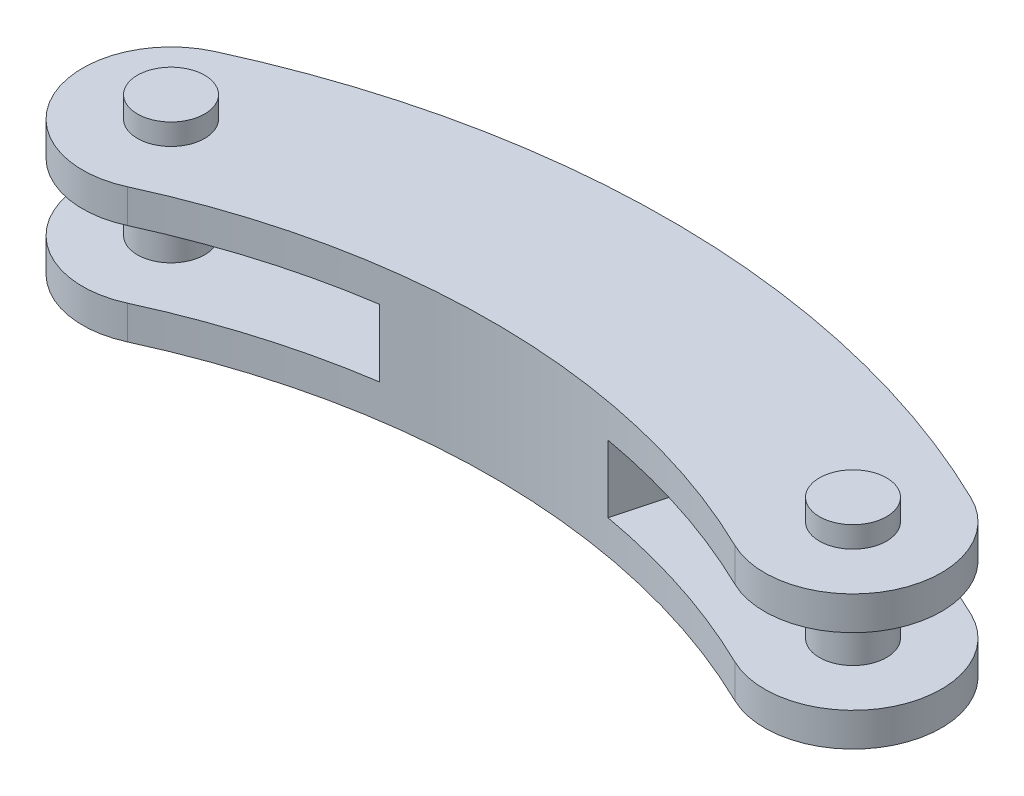
ISO-10303-21;
HEADER;
FILE_DESCRIPTION(('STEP AP214'),'2;1');
FILE_NAME('part.step','',(''),(''),'','','');
FILE_SCHEMA(('AUTOMOTIVE_DESIGN { 1 0 10303 214 1 1 1 1 }'));
ENDSEC;
DATA;
#1=APPLICATION_CONTEXT('core data for automotive mechanical design processes');
#2=APPLICATION_PROTOCOL_DEFINITION('international standard','automotive_design',2000,#1);
#3=PRODUCT_CONTEXT('',#1,'mechanical');
#4=PRODUCT('Part','Part','',(#3));
#5=PRODUCT_RELATED_PRODUCT_CATEGORY('part','',(#4));
#6=PRODUCT_DEFINITION_FORMATION('','',#4);
#7=PRODUCT_DEFINITION_CONTEXT('part definition',#1,'design');
#8=PRODUCT_DEFINITION('design','',#6,#7);
#9=PRODUCT_DEFINITION_SHAPE('','',#8);
#10=(LENGTH_UNIT() NAMED_UNIT(*) SI_UNIT(.MILLI.,.METRE.));
#11=(NAMED_UNIT(*) PLANE_ANGLE_UNIT() SI_UNIT($,.RADIAN.));
#12=(NAMED_UNIT(*) SI_UNIT($,.STERADIAN.) SOLID_ANGLE_UNIT());
#13=UNCERTAINTY_MEASURE_WITH_UNIT(LENGTH_MEASURE(1.E-05),#10,'distance_accuracy_value','');
#14=(GEOMETRIC_REPRESENTATION_CONTEXT(3) GLOBAL_UNCERTAINTY_ASSIGNED_CONTEXT((#13)) GLOBAL_UNIT_ASSIGNED_CONTEXT((#10,
#11,#12)) REPRESENTATION_CONTEXT('',''));
#15=CARTESIAN_POINT('',(0.,0.,0.));
#16=DIRECTION('',(0.,0.,1.));
#17=DIRECTION('',(1.,0.,0.));
#18=AXIS2_PLACEMENT_3D('',#15,#16,#17);
#19=CARTESIAN_POINT('',(46.87153778637,9.5,125.484431174382));
#20=DIRECTION('',(0.,1.,0.));
#21=DIRECTION('',(0.,0.,1.));
#22=AXIS2_PLACEMENT_3D('',#19,#20,#21);
#23=PLANE('',#22);
#24=CARTESIAN_POINT('',(-98.2215427985791,9.5,20.7996918319035));
#25=DIRECTION('',(0.,1.,0.));
#26=DIRECTION('',(0.,0.,1.));
#27=AXIS2_PLACEMENT_3D('',#24,#25,#26);
#28=CIRCLE('',#27,9.49999999999999);
#29=CARTESIAN_POINT('',(-98.2215427985791,9.5,30.2996918319035));
#30=VERTEX_POINT('',#29);
#31=EDGE_CURVE('E321',#30,#30,#28,.T.);
#32=ORIENTED_EDGE('',*,*,#31,.F.);
#33=EDGE_LOOP('',(#32));
#34=FACE_BOUND('',#33,.T.);
#35=CARTESIAN_POINT('',(-3.03538162868096,9.5,227.979793969484));
#36=DIRECTION('',(0.,-1.,0.));
#37=DIRECTION('',(0.,0.,1.));
#38=AXIS2_PLACEMENT_3D('',#35,#36,#37);
#39=CIRCLE('',#38,203.);
#40=CARTESIAN_POINT('',(-87.7844637229323,9.5,43.5168082943575));
#41=VERTEX_POINT('',#40);
#42=CARTESIAN_POINT('',(-32.9069395186056,9.5,27.1896297949683));
#43=VERTEX_POINT('',#42);
#44=EDGE_CURVE('E67',#41,#43,#39,.T.);
#45=ORIENTED_EDGE('',*,*,#44,.T.);
#46=DIRECTION('',(-0.258819045102522,0.,-0.965925826289068));
#47=VECTOR('',#46,1.);
#48=CARTESIAN_POINT('',(-37.5000000000001,9.5,10.0480947161672));
#49=LINE('',#48,#47);
#50=CARTESIAN_POINT('',(-45.9157423473606,9.5,-21.3598833075912));
#51=VERTEX_POINT('',#50);
#52=EDGE_CURVE('E165',#43,#51,#49,.T.);
#53=ORIENTED_EDGE('',*,*,#52,.T.);
#54=CARTESIAN_POINT('',(-3.03538162868096,9.5,227.979793969484));
#55=DIRECTION('',(0.,1.,0.));
#56=DIRECTION('',(0.,0.,1.));
#57=AXIS2_PLACEMENT_3D('',#54,#55,#56);
#58=CIRCLE('',#57,253.);
#59=CARTESIAN_POINT('',(-108.658621874226,9.5,-1.91742463055047));
#60=VERTEX_POINT('',#59);
#61=EDGE_CURVE('E200',#51,#60,#58,.T.);
#62=ORIENTED_EDGE('',*,*,#61,.T.);
#63=CARTESIAN_POINT('',(-98.2215427985791,9.5,20.7996918319035));
#64=DIRECTION('',(0.,1.,0.));
#65=DIRECTION('',(0.,0.,1.));
#66=AXIS2_PLACEMENT_3D('',#63,#64,#65);
#67=CIRCLE('',#66,25.);
#68=EDGE_CURVE('E205',#60,#41,#67,.T.);
#69=ORIENTED_EDGE('',*,*,#68,.T.);
#70=EDGE_LOOP('',(#45,#53,#62,#69));
#71=FACE_BOUND('',#70,.T.);
#72=ADVANCED_FACE('F43',(#34,#71),#23,.T.);
#73=CARTESIAN_POINT('',(96.7784572014209,9.5,22.9890683792794));
#74=DIRECTION('',(0.,-1.,0.));
#75=DIRECTION('',(0.,0.,-1.));
#76=AXIS2_PLACEMENT_3D('',#73,#74,#75);
#77=CYLINDRICAL_SURFACE('',#76,25.);
#78=CARTESIAN_POINT('',(96.7784572014209,0.,22.9890683792794));
#79=DIRECTION('',(0.,1.,0.));
#80=DIRECTION('',(0.,0.,1.));
#81=AXIS2_PLACEMENT_3D('',#78,#79,#80);
#82=CIRCLE('',#81,25.);
#83=CARTESIAN_POINT('',(85.8339573296992,0.,45.4661216238194));
#84=VERTEX_POINT('',#83);
#85=CARTESIAN_POINT('',(107.722957073143,0.,0.512015134739502));
#86=VERTEX_POINT('',#85);
#87=EDGE_CURVE('E195',#84,#86,#82,.T.);
#88=ORIENTED_EDGE('',*,*,#87,.T.);
#89=DIRECTION('',(0.,-1.,0.));
#90=VECTOR('',#89,1.);
#91=CARTESIAN_POINT('',(107.722957073143,9.5,0.512015134739502));
#92=LINE('',#91,#90);
#93=CARTESIAN_POINT('',(107.722957073143,9.5,0.512015134739502));
#94=VERTEX_POINT('',#93);
#95=EDGE_CURVE('E11',#94,#86,#92,.T.);
#96=ORIENTED_EDGE('',*,*,#95,.F.);
#97=CARTESIAN_POINT('',(96.7784572014209,9.5,22.9890683792794));
#98=DIRECTION('',(0.,1.,0.));
#99=DIRECTION('',(0.,0.,1.));
#100=AXIS2_PLACEMENT_3D('',#97,#98,#99);
#101=CIRCLE('',#100,25.);
#102=CARTESIAN_POINT('',(85.8339573296992,9.5,45.4661216238194));
#103=VERTEX_POINT('',#102);
#104=EDGE_CURVE('E196',#103,#94,#101,.T.);
#105=ORIENTED_EDGE('',*,*,#104,.F.);
#106=DIRECTION('',(0.,-1.,0.));
#107=VECTOR('',#106,1.);
#108=CARTESIAN_POINT('',(85.8339573296992,9.5,45.4661216238194));
#109=LINE('',#108,#107);
#110=EDGE_CURVE('E211',#103,#84,#109,.T.);
#111=ORIENTED_EDGE('',*,*,#110,.T.);
#112=EDGE_LOOP('',(#88,#96,#105,#111));
#113=FACE_BOUND('',#112,.T.);
#114=ADVANCED_FACE('F45',(#113),#77,.T.);
#115=CARTESIAN_POINT('',(-3.03538162868096,9.5,227.979793969484));
#116=DIRECTION('',(0.,-1.,0.));
#117=DIRECTION('',(0.,0.,-1.));
#118=AXIS2_PLACEMENT_3D('',#115,#116,#117);
#119=CYLINDRICAL_SURFACE('',#118,253.);
#120=CARTESIAN_POINT('',(-3.03538162868096,0.,227.979793969484));
#121=DIRECTION('',(0.,1.,0.));
#122=DIRECTION('',(0.,0.,1.));
#123=AXIS2_PLACEMENT_3D('',#120,#121,#122);
#124=CIRCLE('',#123,253.);
#125=CARTESIAN_POINT('',(-108.658621874226,0.,-1.91742463055047));
#126=VERTEX_POINT('',#125);
#127=EDGE_CURVE('E215',#86,#126,#124,.T.);
#128=ORIENTED_EDGE('',*,*,#127,.T.);
#129=DIRECTION('',(0.,-1.,0.));
#130=VECTOR('',#129,1.);
#131=CARTESIAN_POINT('',(-108.658621874226,9.5,-1.91742463055047));
#132=LINE('',#131,#130);
#133=EDGE_CURVE('E52',#60,#126,#132,.T.);
#134=ORIENTED_EDGE('',*,*,#133,.F.);
#135=ORIENTED_EDGE('',*,*,#61,.F.);
#136=DIRECTION('',(0.,-1.,0.));
#137=VECTOR('',#136,1.);
#138=CARTESIAN_POINT('',(-45.9157423473606,28.5,-21.3598833075912));
#139=LINE('',#138,#137);
#140=CARTESIAN_POINT('',(-45.9157423473606,28.5,-21.3598833075912));
#141=VERTEX_POINT('',#140);
#142=EDGE_CURVE('E183',#141,#51,#139,.T.);
#143=ORIENTED_EDGE('',*,*,#142,.F.);
#144=CARTESIAN_POINT('',(-3.03538162868096,28.5,227.979793969484));
#145=DIRECTION('',(0.,1.,0.));
#146=DIRECTION('',(0.,0.,1.));
#147=AXIS2_PLACEMENT_3D('',#144,#145,#146);
#148=CIRCLE('',#147,253.);
#149=CARTESIAN_POINT('',(-108.658621874226,28.5,-1.91742463055047));
#150=VERTEX_POINT('',#149);
#151=EDGE_CURVE('E262',#141,#150,#148,.T.);
#152=ORIENTED_EDGE('',*,*,#151,.T.);
#153=DIRECTION('',(0.,-1.,0.));
#154=VECTOR('',#153,1.);
#155=CARTESIAN_POINT('',(-108.658621874226,38.,-1.91742463055047));
#156=LINE('',#155,#154);
#157=CARTESIAN_POINT('',(-108.658621874226,38.,-1.91742463055047));
#158=VERTEX_POINT('',#157);
#159=EDGE_CURVE('E141',#158,#150,#156,.T.);
#160=ORIENTED_EDGE('',*,*,#159,.F.);
#161=CARTESIAN_POINT('',(-3.03538162868096,38.,227.979793969484));
#162=DIRECTION('',(0.,1.,0.));
#163=DIRECTION('',(0.,0.,1.));
#164=AXIS2_PLACEMENT_3D('',#161,#162,#163);
#165=CIRCLE('',#164,253.);
#166=CARTESIAN_POINT('',(107.722957073143,38.,0.512015134739502));
#167=VERTEX_POINT('',#166);
#168=EDGE_CURVE('E133',#167,#158,#165,.T.);
#169=ORIENTED_EDGE('',*,*,#168,.F.);
#170=DIRECTION('',(0.,-1.,0.));
#171=VECTOR('',#170,1.);
#172=CARTESIAN_POINT('',(107.722957073143,38.,0.512015134739502));
#173=LINE('',#172,#171);
#174=CARTESIAN_POINT('',(107.722957073143,28.5,0.512015134739502));
#175=VERTEX_POINT('',#174);
#176=EDGE_CURVE('E138',#167,#175,#173,.T.);
#177=ORIENTED_EDGE('',*,*,#176,.T.);
#178=CARTESIAN_POINT('',(45.6305449352448,28.5,-20.2955120753877));
#179=VERTEX_POINT('',#178);
#180=EDGE_CURVE('E283',#175,#179,#148,.T.);
#181=ORIENTED_EDGE('',*,*,#180,.T.);
#182=DIRECTION('',(0.,-1.,0.));
#183=VECTOR('',#182,1.);
#184=CARTESIAN_POINT('',(45.6305449352448,28.5,-20.2955120753877));
#185=LINE('',#184,#183);
#186=CARTESIAN_POINT('',(45.6305449352448,9.5,-20.2955120753877));
#187=VERTEX_POINT('',#186);
#188=EDGE_CURVE('E187',#179,#187,#185,.T.);
#189=ORIENTED_EDGE('',*,*,#188,.T.);
#190=EDGE_CURVE('E202',#94,#187,#58,.T.);
#191=ORIENTED_EDGE('',*,*,#190,.F.);
#192=ORIENTED_EDGE('',*,*,#95,.T.);
#193=EDGE_LOOP('',(#128,#134,#135,#143,#152,#160,#169,#177,#181,#189,#191,#192));
#194=FACE_BOUND('',#193,.T.);
#195=ADVANCED_FACE('F135',(#194),#119,.T.);
#196=CARTESIAN_POINT('',(-98.2215427985791,9.5,20.7996918319035));
#197=DIRECTION('',(0.,-1.,0.));
#198=DIRECTION('',(0.,0.,-1.));
#199=AXIS2_PLACEMENT_3D('',#196,#197,#198);
#200=CYLINDRICAL_SURFACE('',#199,25.);
#201=CARTESIAN_POINT('',(-98.2215427985791,0.,20.7996918319035));
#202=DIRECTION('',(0.,1.,0.));
#203=DIRECTION('',(0.,0.,1.));
#204=AXIS2_PLACEMENT_3D('',#201,#202,#203);
#205=CIRCLE('',#204,25.);
#206=CARTESIAN_POINT('',(-87.7844637229323,0.,43.5168082943575));
#207=VERTEX_POINT('',#206);
#208=EDGE_CURVE('E218',#126,#207,#205,.T.);
#209=ORIENTED_EDGE('',*,*,#208,.T.);
#210=DIRECTION('',(0.,-1.,0.));
#211=VECTOR('',#210,1.);
#212=CARTESIAN_POINT('',(-87.7844637229323,9.5,43.5168082943575));
#213=LINE('',#212,#211);
#214=EDGE_CURVE('E226',#41,#207,#213,.T.);
#215=ORIENTED_EDGE('',*,*,#214,.F.);
#216=ORIENTED_EDGE('',*,*,#68,.F.);
#217=ORIENTED_EDGE('',*,*,#133,.T.);
#218=EDGE_LOOP('',(#209,#215,#216,#217));
#219=FACE_BOUND('',#218,.T.);
#220=ADVANCED_FACE('F235',(#219),#200,.T.);
#221=CARTESIAN_POINT('',(-3.03538162868096,9.5,227.979793969484));
#222=DIRECTION('',(0.,-1.,0.));
#223=DIRECTION('',(0.,0.,-1.));
#224=AXIS2_PLACEMENT_3D('',#221,#222,#223);
#225=CYLINDRICAL_SURFACE('',#224,203.);
#226=CARTESIAN_POINT('',(-3.03538162868096,0.,227.979793969484));
#227=DIRECTION('',(0.,-1.,0.));
#228=DIRECTION('',(0.,0.,1.));
#229=AXIS2_PLACEMENT_3D('',#226,#227,#228);
#230=CIRCLE('',#229,203.);
#231=EDGE_CURVE('E201',#207,#84,#230,.T.);
#232=ORIENTED_EDGE('',*,*,#231,.T.);
#233=ORIENTED_EDGE('',*,*,#110,.F.);
#234=CARTESIAN_POINT('',(32.6519347436594,9.5,28.1413205712402));
#235=VERTEX_POINT('',#234);
#236=EDGE_CURVE('E208',#235,#103,#39,.T.);
#237=ORIENTED_EDGE('',*,*,#236,.F.);
#238=DIRECTION('',(0.,-1.,0.));
#239=VECTOR('',#238,1.);
#240=CARTESIAN_POINT('',(32.6519347436594,28.5,28.1413205712402));
#241=LINE('',#240,#239);
#242=CARTESIAN_POINT('',(32.6519347436594,28.5,28.1413205712402));
#243=VERTEX_POINT('',#242);
#244=EDGE_CURVE('E191',#243,#235,#241,.T.);
#245=ORIENTED_EDGE('',*,*,#244,.F.);
#246=CARTESIAN_POINT('',(-3.03538162868096,28.5,227.979793969484));
#247=DIRECTION('',(0.,-1.,0.));
#248=DIRECTION('',(0.,0.,1.));
#249=AXIS2_PLACEMENT_3D('',#246,#247,#248);
#250=CIRCLE('',#249,203.);
#251=CARTESIAN_POINT('',(85.8339573296992,28.5,45.4661216238194));
#252=VERTEX_POINT('',#251);
#253=EDGE_CURVE('E266',#243,#252,#250,.T.);
#254=ORIENTED_EDGE('',*,*,#253,.T.);
#255=DIRECTION('',(0.,-1.,0.));
#256=VECTOR('',#255,1.);
#257=CARTESIAN_POINT('',(85.8339573296992,38.,45.4661216238194));
#258=LINE('',#257,#256);
#259=CARTESIAN_POINT('',(85.8339573296992,38.,45.4661216238194));
#260=VERTEX_POINT('',#259);
#261=EDGE_CURVE('E273',#260,#252,#258,.T.);
#262=ORIENTED_EDGE('',*,*,#261,.F.);
#263=CARTESIAN_POINT('',(-3.03538162868096,38.,227.979793969484));
#264=DIRECTION('',(0.,-1.,0.));
#265=DIRECTION('',(0.,0.,1.));
#266=AXIS2_PLACEMENT_3D('',#263,#264,#265);
#267=CIRCLE('',#266,203.);
#268=CARTESIAN_POINT('',(-87.7844637229324,38.,43.5168082943575));
#269=VERTEX_POINT('',#268);
#270=EDGE_CURVE('E151',#269,#260,#267,.T.);
#271=ORIENTED_EDGE('',*,*,#270,.F.);
#272=DIRECTION('',(0.,-1.,0.));
#273=VECTOR('',#272,1.);
#274=CARTESIAN_POINT('',(-87.7844637229324,38.,43.5168082943575));
#275=LINE('',#274,#273);
#276=CARTESIAN_POINT('',(-87.7844637229324,28.5,43.5168082943575));
#277=VERTEX_POINT('',#276);
#278=EDGE_CURVE('E167',#269,#277,#275,.T.);
#279=ORIENTED_EDGE('',*,*,#278,.T.);
#280=CARTESIAN_POINT('',(-32.9069395186056,28.5,27.1896297949683));
#281=VERTEX_POINT('',#280);
#282=EDGE_CURVE('E156',#277,#281,#250,.T.);
#283=ORIENTED_EDGE('',*,*,#282,.T.);
#284=DIRECTION('',(0.,-1.,0.));
#285=VECTOR('',#284,1.);
#286=CARTESIAN_POINT('',(-32.9069395186056,28.5,27.1896297949683));
#287=LINE('',#286,#285);
#288=EDGE_CURVE('E177',#281,#43,#287,.T.);
#289=ORIENTED_EDGE('',*,*,#288,.T.);
#290=ORIENTED_EDGE('',*,*,#44,.F.);
#291=ORIENTED_EDGE('',*,*,#214,.T.);
#292=EDGE_LOOP('',(#232,#233,#237,#245,#254,#262,#271,#279,#283,#289,#290,#291));
#293=FACE_BOUND('',#292,.T.);
#294=ADVANCED_FACE('F244',(#293),#225,.F.);
#295=CARTESIAN_POINT('',(96.7784572014209,9.5,22.9890683792794));
#296=DIRECTION('',(0.,1.,0.));
#297=DIRECTION('',(0.,0.,1.));
#298=AXIS2_PLACEMENT_3D('',#295,#296,#297);
#299=CIRCLE('',#298,9.49999999999999);
#300=CARTESIAN_POINT('',(96.7784572014209,9.5,32.4890683792794));
#301=VERTEX_POINT('',#300);
#302=EDGE_CURVE('E282',#301,#301,#299,.T.);
#303=ORIENTED_EDGE('',*,*,#302,.F.);
#304=EDGE_LOOP('',(#303));
#305=FACE_BOUND('',#304,.T.);
#306=DIRECTION('',(0.258819045102522,0.,-0.965925826289068));
#307=VECTOR('',#306,1.);
#308=CARTESIAN_POINT('',(37.5000000000001,9.5,10.0480947161672));
#309=LINE('',#308,#307);
#310=EDGE_CURVE('E59',#235,#187,#309,.T.);
#311=ORIENTED_EDGE('',*,*,#310,.F.);
#312=ORIENTED_EDGE('',*,*,#236,.T.);
#313=ORIENTED_EDGE('',*,*,#104,.T.);
#314=ORIENTED_EDGE('',*,*,#190,.T.);
#315=EDGE_LOOP('',(#311,#312,#313,#314));
#316=FACE_BOUND('',#315,.T.);
#317=ADVANCED_FACE('F248',(#305,#316),#23,.T.);
#318=CARTESIAN_POINT('',(46.87153778637,0.,125.484431174382));
#319=DIRECTION('',(0.,1.,0.));
#320=DIRECTION('',(0.,0.,1.));
#321=AXIS2_PLACEMENT_3D('',#318,#319,#320);
#322=PLANE('',#321);
#323=CARTESIAN_POINT('',(-98.2215427985791,0.,20.7996918319035));
#324=DIRECTION('',(0.,1.,0.));
#325=DIRECTION('',(0.,0.,1.));
#326=AXIS2_PLACEMENT_3D('',#323,#324,#325);
#327=CIRCLE('',#326,9.49999999999999);
#328=CARTESIAN_POINT('',(-98.2215427985791,0.,30.2996918319035));
#329=VERTEX_POINT('',#328);
#330=EDGE_CURVE('E332',#329,#329,#327,.T.);
#331=ORIENTED_EDGE('',*,*,#330,.T.);
#332=EDGE_LOOP('',(#331));
#333=FACE_BOUND('',#332,.T.);
#334=CARTESIAN_POINT('',(96.7784572014209,0.,22.9890683792794));
#335=DIRECTION('',(0.,1.,0.));
#336=DIRECTION('',(0.,0.,1.));
#337=AXIS2_PLACEMENT_3D('',#334,#335,#336);
#338=CIRCLE('',#337,9.49999999999999);
#339=CARTESIAN_POINT('',(96.7784572014209,0.,32.4890683792794));
#340=VERTEX_POINT('',#339);
#341=EDGE_CURVE('E348',#340,#340,#338,.T.);
#342=ORIENTED_EDGE('',*,*,#341,.T.);
#343=EDGE_LOOP('',(#342));
#344=FACE_BOUND('',#343,.T.);
#345=ORIENTED_EDGE('',*,*,#87,.F.);
#346=ORIENTED_EDGE('',*,*,#231,.F.);
#347=ORIENTED_EDGE('',*,*,#208,.F.);
#348=ORIENTED_EDGE('',*,*,#127,.F.);
#349=EDGE_LOOP('',(#345,#346,#347,#348));
#350=FACE_BOUND('',#349,.T.);
#351=ADVANCED_FACE('F241',(#333,#344,#350),#322,.F.);
#352=CARTESIAN_POINT('',(37.5000000000001,28.5,10.0480947161672));
#353=DIRECTION('',(-0.965925826289068,0.,-0.258819045102522));
#354=DIRECTION('',(-0.258819045102522,0.,0.965925826289068));
#355=AXIS2_PLACEMENT_3D('',#352,#353,#354);
#356=PLANE('',#355);
#357=ORIENTED_EDGE('',*,*,#310,.T.);
#358=ORIENTED_EDGE('',*,*,#188,.F.);
#359=DIRECTION('',(0.258819045102522,0.,-0.965925826289068));
#360=VECTOR('',#359,1.);
#361=CARTESIAN_POINT('',(37.5000000000001,28.5,10.0480947161672));
#362=LINE('',#361,#360);
#363=EDGE_CURVE('E171',#243,#179,#362,.T.);
#364=ORIENTED_EDGE('',*,*,#363,.F.);
#365=ORIENTED_EDGE('',*,*,#244,.T.);
#366=EDGE_LOOP('',(#357,#358,#364,#365));
#367=FACE_BOUND('',#366,.T.);
#368=ADVANCED_FACE('F294',(#367),#356,.F.);
#369=CARTESIAN_POINT('',(-37.5000000000001,28.5,10.0480947161672));
#370=DIRECTION('',(-0.965925826289068,0.,0.258819045102521));
#371=DIRECTION('',(0.258819045102522,0.,0.965925826289068));
#372=AXIS2_PLACEMENT_3D('',#369,#370,#371);
#373=PLANE('',#372);
#374=ORIENTED_EDGE('',*,*,#52,.F.);
#375=ORIENTED_EDGE('',*,*,#288,.F.);
#376=DIRECTION('',(-0.258819045102522,0.,-0.965925826289068));
#377=VECTOR('',#376,1.);
#378=CARTESIAN_POINT('',(-37.5000000000001,28.5,10.0480947161672));
#379=LINE('',#378,#377);
#380=EDGE_CURVE('E174',#281,#141,#379,.T.);
#381=ORIENTED_EDGE('',*,*,#380,.T.);
#382=ORIENTED_EDGE('',*,*,#142,.T.);
#383=EDGE_LOOP('',(#374,#375,#381,#382));
#384=FACE_BOUND('',#383,.T.);
#385=ADVANCED_FACE('F255',(#384),#373,.T.);
#386=CARTESIAN_POINT('',(46.87153778637,28.5,125.484431174382));
#387=DIRECTION('',(0.,1.,0.));
#388=DIRECTION('',(0.,0.,1.));
#389=AXIS2_PLACEMENT_3D('',#386,#387,#388);
#390=PLANE('',#389);
#391=CARTESIAN_POINT('',(96.7784572014209,28.5,22.9890683792794));
#392=DIRECTION('',(0.,1.,0.));
#393=DIRECTION('',(0.,0.,1.));
#394=AXIS2_PLACEMENT_3D('',#391,#392,#393);
#395=CIRCLE('',#394,9.49999999999999);
#396=CARTESIAN_POINT('',(96.7784572014209,28.5,32.4890683792794));
#397=VERTEX_POINT('',#396);
#398=EDGE_CURVE('E355',#397,#397,#395,.T.);
#399=ORIENTED_EDGE('',*,*,#398,.T.);
#400=EDGE_LOOP('',(#399));
#401=FACE_BOUND('',#400,.T.);
#402=ORIENTED_EDGE('',*,*,#253,.F.);
#403=ORIENTED_EDGE('',*,*,#363,.T.);
#404=ORIENTED_EDGE('',*,*,#180,.F.);
#405=CARTESIAN_POINT('',(96.7784572014209,28.5,22.9890683792794));
#406=DIRECTION('',(0.,1.,0.));
#407=DIRECTION('',(0.,0.,1.));
#408=AXIS2_PLACEMENT_3D('',#405,#406,#407);
#409=CIRCLE('',#408,25.);
#410=EDGE_CURVE('E160',#252,#175,#409,.T.);
#411=ORIENTED_EDGE('',*,*,#410,.F.);
#412=EDGE_LOOP('',(#402,#403,#404,#411));
#413=FACE_BOUND('',#412,.T.);
#414=ADVANCED_FACE('F291',(#401,#413),#390,.F.);
#415=CARTESIAN_POINT('',(96.7784572014209,38.,22.9890683792794));
#416=DIRECTION('',(0.,-1.,0.));
#417=DIRECTION('',(0.,0.,-1.));
#418=AXIS2_PLACEMENT_3D('',#415,#416,#417);
#419=CYLINDRICAL_SURFACE('',#418,25.);
#420=ORIENTED_EDGE('',*,*,#410,.T.);
#421=ORIENTED_EDGE('',*,*,#176,.F.);
#422=CARTESIAN_POINT('',(96.7784572014209,38.,22.9890683792794));
#423=DIRECTION('',(0.,1.,0.));
#424=DIRECTION('',(0.,0.,1.));
#425=AXIS2_PLACEMENT_3D('',#422,#423,#424);
#426=CIRCLE('',#425,25.);
#427=EDGE_CURVE('E146',#260,#167,#426,.T.);
#428=ORIENTED_EDGE('',*,*,#427,.F.);
#429=ORIENTED_EDGE('',*,*,#261,.T.);
#430=EDGE_LOOP('',(#420,#421,#428,#429));
#431=FACE_BOUND('',#430,.T.);
#432=ADVANCED_FACE('F158',(#431),#419,.T.);
#433=CARTESIAN_POINT('',(-98.2215427985791,38.,20.7996918319035));
#434=DIRECTION('',(0.,-1.,0.));
#435=DIRECTION('',(0.,0.,-1.));
#436=AXIS2_PLACEMENT_3D('',#433,#434,#435);
#437=CYLINDRICAL_SURFACE('',#436,25.);
#438=CARTESIAN_POINT('',(-98.2215427985791,28.5,20.7996918319035));
#439=DIRECTION('',(0.,1.,0.));
#440=DIRECTION('',(0.,0.,1.));
#441=AXIS2_PLACEMENT_3D('',#438,#439,#440);
#442=CIRCLE('',#441,25.);
#443=EDGE_CURVE('E269',#150,#277,#442,.T.);
#444=ORIENTED_EDGE('',*,*,#443,.T.);
#445=ORIENTED_EDGE('',*,*,#278,.F.);
#446=CARTESIAN_POINT('',(-98.2215427985791,38.,20.7996918319035));
#447=DIRECTION('',(0.,1.,0.));
#448=DIRECTION('',(0.,0.,1.));
#449=AXIS2_PLACEMENT_3D('',#446,#447,#448);
#450=CIRCLE('',#449,25.);
#451=EDGE_CURVE('E145',#158,#269,#450,.T.);
#452=ORIENTED_EDGE('',*,*,#451,.F.);
#453=ORIENTED_EDGE('',*,*,#159,.T.);
#454=EDGE_LOOP('',(#444,#445,#452,#453));
#455=FACE_BOUND('',#454,.T.);
#456=ADVANCED_FACE('F289',(#455),#437,.T.);
#457=CARTESIAN_POINT('',(46.87153778637,38.,125.484431174382));
#458=DIRECTION('',(0.,1.,0.));
#459=DIRECTION('',(0.,0.,1.));
#460=AXIS2_PLACEMENT_3D('',#457,#458,#459);
#461=PLANE('',#460);
#462=CARTESIAN_POINT('',(-98.2215427985791,38.,20.7996918319035));
#463=DIRECTION('',(0.,1.,0.));
#464=DIRECTION('',(0.,0.,1.));
#465=AXIS2_PLACEMENT_3D('',#462,#463,#464);
#466=CIRCLE('',#465,9.49999999999999);
#467=CARTESIAN_POINT('',(-98.2215427985791,38.,30.2996918319035));
#468=VERTEX_POINT('',#467);
#469=EDGE_CURVE('E325',#468,#468,#466,.T.);
#470=ORIENTED_EDGE('',*,*,#469,.F.);
#471=EDGE_LOOP('',(#470));
#472=FACE_BOUND('',#471,.T.);
#473=CARTESIAN_POINT('',(96.7784572014209,38.,22.9890683792794));
#474=DIRECTION('',(0.,1.,0.));
#475=DIRECTION('',(0.,0.,1.));
#476=AXIS2_PLACEMENT_3D('',#473,#474,#475);
#477=CIRCLE('',#476,9.49999999999999);
#478=CARTESIAN_POINT('',(96.7784572014209,38.,32.4890683792794));
#479=VERTEX_POINT('',#478);
#480=EDGE_CURVE('E328',#479,#479,#477,.T.);
#481=ORIENTED_EDGE('',*,*,#480,.F.);
#482=EDGE_LOOP('',(#481));
#483=FACE_BOUND('',#482,.T.);
#484=ORIENTED_EDGE('',*,*,#427,.T.);
#485=ORIENTED_EDGE('',*,*,#168,.T.);
#486=ORIENTED_EDGE('',*,*,#451,.T.);
#487=ORIENTED_EDGE('',*,*,#270,.T.);
#488=EDGE_LOOP('',(#484,#485,#486,#487));
#489=FACE_BOUND('',#488,.T.);
#490=ADVANCED_FACE('F149',(#472,#483,#489),#461,.T.);
#491=CARTESIAN_POINT('',(-98.2215427985791,28.5,20.7996918319035));
#492=DIRECTION('',(0.,1.,0.));
#493=DIRECTION('',(0.,0.,1.));
#494=AXIS2_PLACEMENT_3D('',#491,#492,#493);
#495=CIRCLE('',#494,9.49999999999999);
#496=CARTESIAN_POINT('',(-98.2215427985791,28.5,30.2996918319035));
#497=VERTEX_POINT('',#496);
#498=EDGE_CURVE('E339',#497,#497,#495,.T.);
#499=ORIENTED_EDGE('',*,*,#498,.T.);
#500=EDGE_LOOP('',(#499));
#501=FACE_BOUND('',#500,.T.);
#502=ORIENTED_EDGE('',*,*,#380,.F.);
#503=ORIENTED_EDGE('',*,*,#282,.F.);
#504=ORIENTED_EDGE('',*,*,#443,.F.);
#505=ORIENTED_EDGE('',*,*,#151,.F.);
#506=EDGE_LOOP('',(#502,#503,#504,#505));
#507=FACE_BOUND('',#506,.T.);
#508=ADVANCED_FACE('F260',(#501,#507),#390,.F.);
#509=CARTESIAN_POINT('',(-98.2215427985791,-6.00000000000001,20.7996918319035));
#510=DIRECTION('',(0.,1.,0.));
#511=DIRECTION('',(0.,0.,1.));
#512=AXIS2_PLACEMENT_3D('',#509,#510,#511);
#513=CYLINDRICAL_SURFACE('',#512,9.49999999999999);
#514=ORIENTED_EDGE('',*,*,#31,.T.);
#515=EDGE_LOOP('',(#514));
#516=FACE_BOUND('',#515,.T.);
#517=ORIENTED_EDGE('',*,*,#498,.F.);
#518=EDGE_LOOP('',(#517));
#519=FACE_BOUND('',#518,.T.);
#520=ADVANCED_FACE('F396',(#516,#519),#513,.T.);
#521=CARTESIAN_POINT('',(-98.2215427985791,44.,20.7996918319035));
#522=DIRECTION('',(0.,1.,0.));
#523=DIRECTION('',(0.,0.,1.));
#524=AXIS2_PLACEMENT_3D('',#521,#522,#523);
#525=PLANE('',#524);
#526=CARTESIAN_POINT('',(-98.2215427985791,44.,20.7996918319035));
#527=DIRECTION('',(0.,1.,0.));
#528=DIRECTION('',(0.,0.,1.));
#529=AXIS2_PLACEMENT_3D('',#526,#527,#528);
#530=CIRCLE('',#529,9.49999999999999);
#531=CARTESIAN_POINT('',(-98.2215427985791,44.,30.2996918319035));
#532=VERTEX_POINT('',#531);
#533=EDGE_CURVE('E344',#532,#532,#530,.T.);
#534=ORIENTED_EDGE('',*,*,#533,.T.);
#535=EDGE_LOOP('',(#534));
#536=FACE_BOUND('',#535,.T.);
#537=ADVANCED_FACE('F392',(#536),#525,.T.);
#538=ORIENTED_EDGE('',*,*,#469,.T.);
#539=EDGE_LOOP('',(#538));
#540=FACE_BOUND('',#539,.T.);
#541=ORIENTED_EDGE('',*,*,#533,.F.);
#542=EDGE_LOOP('',(#541));
#543=FACE_BOUND('',#542,.T.);
#544=ADVANCED_FACE('F395',(#540,#543),#513,.T.);
#545=CARTESIAN_POINT('',(-98.2215427985791,-6.00000000000001,20.7996918319035));
#546=DIRECTION('',(0.,1.,0.));
#547=DIRECTION('',(0.,0.,1.));
#548=AXIS2_PLACEMENT_3D('',#545,#546,#547);
#549=CIRCLE('',#548,9.49999999999999);
#550=CARTESIAN_POINT('',(-98.2215427985791,-6.00000000000001,30.2996918319035));
#551=VERTEX_POINT('',#550);
#552=EDGE_CURVE('E343',#551,#551,#549,.T.);
#553=ORIENTED_EDGE('',*,*,#552,.T.);
#554=EDGE_LOOP('',(#553));
#555=FACE_BOUND('',#554,.T.);
#556=ORIENTED_EDGE('',*,*,#330,.F.);
#557=EDGE_LOOP('',(#556));
#558=FACE_BOUND('',#557,.T.);
#559=ADVANCED_FACE('F390',(#555,#558),#513,.T.);
#560=CARTESIAN_POINT('',(-98.2215427985791,-6.00000000000001,20.7996918319035));
#561=DIRECTION('',(0.,1.,0.));
#562=DIRECTION('',(0.,0.,1.));
#563=AXIS2_PLACEMENT_3D('',#560,#561,#562);
#564=PLANE('',#563);
#565=ORIENTED_EDGE('',*,*,#552,.F.);
#566=EDGE_LOOP('',(#565));
#567=FACE_BOUND('',#566,.T.);
#568=ADVANCED_FACE('F383',(#567),#564,.F.);
#569=CARTESIAN_POINT('',(96.7784572014209,44.,22.9890683792794));
#570=DIRECTION('',(0.,1.,0.));
#571=DIRECTION('',(0.,0.,1.));
#572=AXIS2_PLACEMENT_3D('',#569,#570,#571);
#573=PLANE('',#572);
#574=CARTESIAN_POINT('',(96.7784572014209,44.,22.9890683792794));
#575=DIRECTION('',(0.,1.,0.));
#576=DIRECTION('',(0.,0.,1.));
#577=AXIS2_PLACEMENT_3D('',#574,#575,#576);
#578=CIRCLE('',#577,9.49999999999999);
#579=CARTESIAN_POINT('',(96.7784572014209,44.,32.4890683792794));
#580=VERTEX_POINT('',#579);
#581=EDGE_CURVE('E360',#580,#580,#578,.T.);
#582=ORIENTED_EDGE('',*,*,#581,.T.);
#583=EDGE_LOOP('',(#582));
#584=FACE_BOUND('',#583,.T.);
#585=ADVANCED_FACE('F381',(#584),#573,.T.);
#586=CARTESIAN_POINT('',(96.7784572014209,-6.00000000000001,22.9890683792794));
#587=DIRECTION('',(0.,1.,0.));
#588=DIRECTION('',(0.,0.,1.));
#589=AXIS2_PLACEMENT_3D('',#586,#587,#588);
#590=CYLINDRICAL_SURFACE('',#589,9.49999999999999);
#591=ORIENTED_EDGE('',*,*,#480,.T.);
#592=EDGE_LOOP('',(#591));
#593=FACE_BOUND('',#592,.T.);
#594=ORIENTED_EDGE('',*,*,#581,.F.);
#595=EDGE_LOOP('',(#594));
#596=FACE_BOUND('',#595,.T.);
#597=ADVANCED_FACE('F379',(#593,#596),#590,.T.);
#598=ORIENTED_EDGE('',*,*,#302,.T.);
#599=EDGE_LOOP('',(#598));
#600=FACE_BOUND('',#599,.T.);
#601=ORIENTED_EDGE('',*,*,#398,.F.);
#602=EDGE_LOOP('',(#601));
#603=FACE_BOUND('',#602,.T.);
#604=ADVANCED_FACE('F377',(#600,#603),#590,.T.);
#605=CARTESIAN_POINT('',(96.7784572014209,-6.00000000000001,22.9890683792794));
#606=DIRECTION('',(0.,1.,0.));
#607=DIRECTION('',(0.,0.,1.));
#608=AXIS2_PLACEMENT_3D('',#605,#606,#607);
#609=CIRCLE('',#608,9.49999999999999);
#610=CARTESIAN_POINT('',(96.7784572014209,-6.00000000000001,32.4890683792794));
#611=VERTEX_POINT('',#610);
#612=EDGE_CURVE('E359',#611,#611,#609,.T.);
#613=ORIENTED_EDGE('',*,*,#612,.T.);
#614=EDGE_LOOP('',(#613));
#615=FACE_BOUND('',#614,.T.);
#616=ORIENTED_EDGE('',*,*,#341,.F.);
#617=EDGE_LOOP('',(#616));
#618=FACE_BOUND('',#617,.T.);
#619=ADVANCED_FACE('F368',(#615,#618),#590,.T.);
#620=CARTESIAN_POINT('',(96.7784572014209,-6.00000000000001,22.9890683792794));
#621=DIRECTION('',(0.,1.,0.));
#622=DIRECTION('',(0.,0.,1.));
#623=AXIS2_PLACEMENT_3D('',#620,#621,#622);
#624=PLANE('',#623);
#625=ORIENTED_EDGE('',*,*,#612,.F.);
#626=EDGE_LOOP('',(#625));
#627=FACE_BOUND('',#626,.T.);
#628=ADVANCED_FACE('F371',(#627),#624,.F.);
#629=CLOSED_SHELL('',(#72,#114,#195,#220,#294,#317,#351,#368,#385,#414,#432,#456,#490,#508,#520,
#537,#544,#559,#568,#585,#597,#604,#619,#628));
#630=MANIFOLD_SOLID_BREP('B2',#629);
#631=ADVANCED_BREP_SHAPE_REPRESENTATION('',(#18,#630),#14);
#632=SHAPE_DEFINITION_REPRESENTATION(#9,#631);
ENDSEC;
END-ISO-10303-21;
